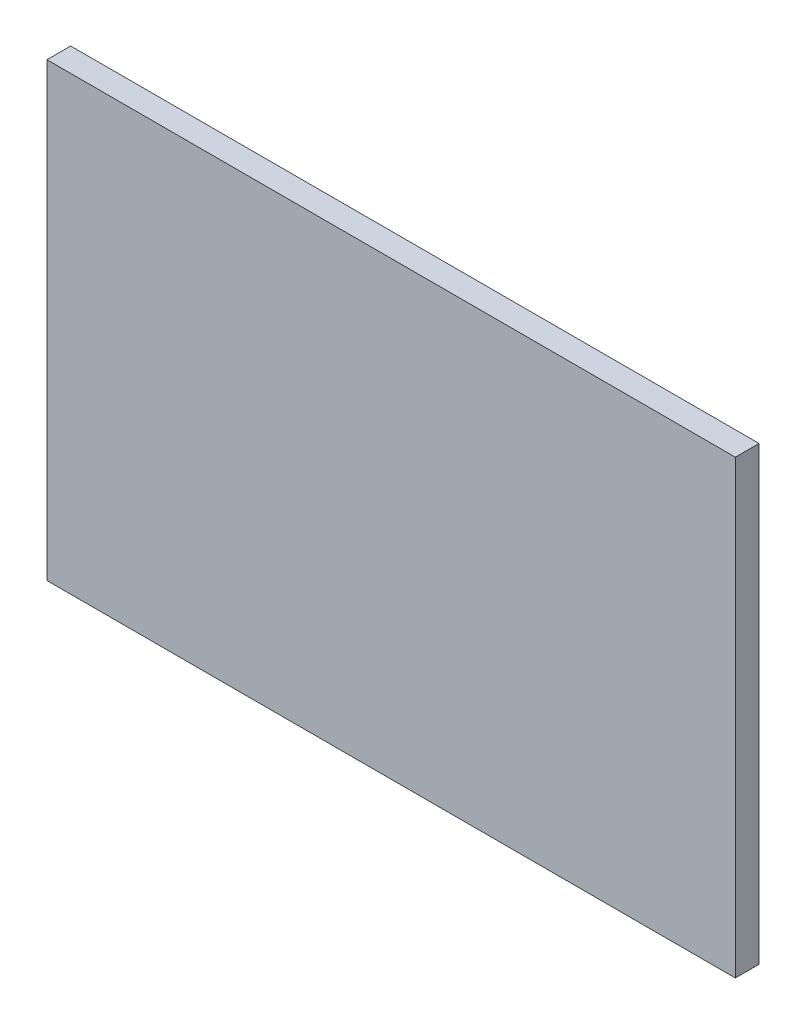
ISO-10303-21;
HEADER;
FILE_DESCRIPTION(('STEP AP214'),'2;1');
FILE_NAME('part.step','',(''),(''),'','','');
FILE_SCHEMA(('AUTOMOTIVE_DESIGN { 1 0 10303 214 1 1 1 1 }'));
ENDSEC;
DATA;
#1=APPLICATION_CONTEXT('core data for automotive mechanical design processes');
#2=APPLICATION_PROTOCOL_DEFINITION('international standard','automotive_design',2000,#1);
#3=PRODUCT_CONTEXT('',#1,'mechanical');
#4=PRODUCT('Part','Part','',(#3));
#5=PRODUCT_RELATED_PRODUCT_CATEGORY('part','',(#4));
#6=PRODUCT_DEFINITION_FORMATION('','',#4);
#7=PRODUCT_DEFINITION_CONTEXT('part definition',#1,'design');
#8=PRODUCT_DEFINITION('design','',#6,#7);
#9=PRODUCT_DEFINITION_SHAPE('','',#8);
#10=(LENGTH_UNIT() NAMED_UNIT(*) SI_UNIT(.MILLI.,.METRE.));
#11=(NAMED_UNIT(*) PLANE_ANGLE_UNIT() SI_UNIT($,.RADIAN.));
#12=(NAMED_UNIT(*) SI_UNIT($,.STERADIAN.) SOLID_ANGLE_UNIT());
#13=UNCERTAINTY_MEASURE_WITH_UNIT(LENGTH_MEASURE(1.E-05),#10,'distance_accuracy_value','');
#14=(GEOMETRIC_REPRESENTATION_CONTEXT(3) GLOBAL_UNCERTAINTY_ASSIGNED_CONTEXT((#13)) GLOBAL_UNIT_ASSIGNED_CONTEXT((#10,
#11,#12)) REPRESENTATION_CONTEXT('',''));
#15=CARTESIAN_POINT('',(0.,0.,0.));
#16=DIRECTION('',(0.,0.,1.));
#17=DIRECTION('',(1.,0.,0.));
#18=AXIS2_PLACEMENT_3D('',#15,#16,#17);
#19=CARTESIAN_POINT('',(12.224999298474,-8.025000596618,0.5));
#20=DIRECTION('',(0.,0.,1.));
#21=DIRECTION('',(1.,0.,0.));
#22=AXIS2_PLACEMENT_3D('',#19,#20,#21);
#23=PLANE('',#22);
#24=DIRECTION('',(8.74227765734797E-08,-0.999999999999996,0.));
#25=VECTOR('',#24,1.);
#26=CARTESIAN_POINT('',(10.774999298474,-8.025000723382,0.5));
#27=LINE('',#26,#25);
#28=CARTESIAN_POINT('',(10.7749993399999,-8.97500072338176,0.5));
#29=VERTEX_POINT('',#28);
#30=CARTESIAN_POINT('',(10.774999298474,-8.02500069169051,0.5));
#31=VERTEX_POINT('',#30);
#32=EDGE_CURVE('E76',#29,#31,#27,.F.);
#33=ORIENTED_EDGE('',*,*,#32,.F.);
#34=DIRECTION('',(0.999999999999996,8.74227765734797E-08,0.));
#35=VECTOR('',#34,1.);
#36=CARTESIAN_POINT('',(12.224999381526,-8.975000596618,0.5));
#37=LINE('',#36,#35);
#38=CARTESIAN_POINT('',(12.2249993815258,-8.975000628309,0.5));
#39=VERTEX_POINT('',#38);
#40=EDGE_CURVE('E58',#39,#29,#37,.F.);
#41=ORIENTED_EDGE('',*,*,#40,.F.);
#42=DIRECTION('',(8.74227765734797E-08,-0.999999999999996,0.));
#43=VECTOR('',#42,1.);
#44=CARTESIAN_POINT('',(12.224999298474,-8.025000596618,0.5));
#45=LINE('',#44,#43);
#46=CARTESIAN_POINT('',(12.224999319237,-8.025000596618,0.5));
#47=VERTEX_POINT('',#46);
#48=EDGE_CURVE('E20',#39,#47,#45,.F.);
#49=ORIENTED_EDGE('',*,*,#48,.T.);
#50=DIRECTION('',(0.999999999999996,8.74227765734797E-08,0.));
#51=VECTOR('',#50,1.);
#52=CARTESIAN_POINT('',(12.224999298474,-8.025000596618,0.5));
#53=LINE('',#52,#51);
#54=EDGE_CURVE('E55',#47,#31,#53,.F.);
#55=ORIENTED_EDGE('',*,*,#54,.T.);
#56=EDGE_LOOP('',(#33,#41,#49,#55));
#57=FACE_BOUND('',#56,.T.);
#58=ADVANCED_FACE('F17',(#57),#23,.T.);
#59=CARTESIAN_POINT('',(12.224999298474,-8.025000596618,0.45));
#60=DIRECTION('',(-0.999999999999996,-8.74227765734797E-08,0.));
#61=DIRECTION('',(8.74227765734797E-08,-0.999999999999996,0.));
#62=AXIS2_PLACEMENT_3D('',#59,#60,#61);
#63=PLANE('',#62);
#64=DIRECTION('',(0.,0.,1.));
#65=VECTOR('',#64,1.);
#66=CARTESIAN_POINT('',(12.224999381526,-8.975000596618,0.45));
#67=LINE('',#66,#65);
#68=CARTESIAN_POINT('',(12.2249993815258,-8.975000628309,0.45));
#69=VERTEX_POINT('',#68);
#70=EDGE_CURVE('E78',#69,#39,#67,.T.);
#71=ORIENTED_EDGE('',*,*,#70,.F.);
#72=DIRECTION('',(0.,1.,0.));
#73=VECTOR('',#72,1.);
#74=CARTESIAN_POINT('',(12.224999381526,-8.025000596618,0.45));
#75=LINE('',#74,#73);
#76=CARTESIAN_POINT('',(12.224999319237,-8.025000596618,0.45));
#77=VERTEX_POINT('',#76);
#78=EDGE_CURVE('E73',#69,#77,#75,.T.);
#79=ORIENTED_EDGE('',*,*,#78,.T.);
#80=DIRECTION('',(0.,0.,1.));
#81=VECTOR('',#80,1.);
#82=CARTESIAN_POINT('',(12.224999298474,-8.025000596618,0.45));
#83=LINE('',#82,#81);
#84=EDGE_CURVE('E63',#77,#47,#83,.T.);
#85=ORIENTED_EDGE('',*,*,#84,.T.);
#86=ORIENTED_EDGE('',*,*,#48,.F.);
#87=EDGE_LOOP('',(#71,#79,#85,#86));
#88=FACE_BOUND('',#87,.T.);
#89=ADVANCED_FACE('F72',(#88),#63,.F.);
#90=CARTESIAN_POINT('',(12.224999298474,-8.025000596618,0.45));
#91=DIRECTION('',(8.74227765734797E-08,-0.999999999999996,0.));
#92=DIRECTION('',(0.999999999999996,8.74227765734797E-08,0.));
#93=AXIS2_PLACEMENT_3D('',#90,#91,#92);
#94=PLANE('',#93);
#95=ORIENTED_EDGE('',*,*,#54,.F.);
#96=ORIENTED_EDGE('',*,*,#84,.F.);
#97=DIRECTION('',(1.,0.,0.));
#98=VECTOR('',#97,1.);
#99=CARTESIAN_POINT('',(12.224999298474,-8.025000596618,0.45));
#100=LINE('',#99,#98);
#101=CARTESIAN_POINT('',(10.774999298474,-8.02500069169051,0.45));
#102=VERTEX_POINT('',#101);
#103=EDGE_CURVE('E83',#77,#102,#100,.F.);
#104=ORIENTED_EDGE('',*,*,#103,.T.);
#105=DIRECTION('',(0.,0.,1.));
#106=VECTOR('',#105,1.);
#107=CARTESIAN_POINT('',(10.774999298474,-8.025000723382,0.45));
#108=LINE('',#107,#106);
#109=EDGE_CURVE('E69',#31,#102,#108,.F.);
#110=ORIENTED_EDGE('',*,*,#109,.F.);
#111=EDGE_LOOP('',(#95,#96,#104,#110));
#112=FACE_BOUND('',#111,.T.);
#113=ADVANCED_FACE('F66',(#112),#94,.F.);
#114=CARTESIAN_POINT('',(10.774999298474,-8.025000723382,0.45));
#115=DIRECTION('',(-0.999999999999996,-8.74227765734797E-08,0.));
#116=DIRECTION('',(8.74227765734797E-08,-0.999999999999996,0.));
#117=AXIS2_PLACEMENT_3D('',#114,#115,#116);
#118=PLANE('',#117);
#119=DIRECTION('',(0.,0.,1.));
#120=VECTOR('',#119,1.);
#121=CARTESIAN_POINT('',(10.774999381526,-8.97500072338103,0.45));
#122=LINE('',#121,#120);
#123=CARTESIAN_POINT('',(10.7749993607628,-8.97500072338176,0.45));
#124=VERTEX_POINT('',#123);
#125=EDGE_CURVE('E34',#29,#124,#122,.F.);
#126=ORIENTED_EDGE('',*,*,#125,.F.);
#127=ORIENTED_EDGE('',*,*,#32,.T.);
#128=ORIENTED_EDGE('',*,*,#109,.T.);
#129=DIRECTION('',(0.,1.,0.));
#130=VECTOR('',#129,1.);
#131=CARTESIAN_POINT('',(10.774999298474,-8.025000596618,0.45));
#132=LINE('',#131,#130);
#133=EDGE_CURVE('E26',#102,#124,#132,.F.);
#134=ORIENTED_EDGE('',*,*,#133,.T.);
#135=EDGE_LOOP('',(#126,#127,#128,#134));
#136=FACE_BOUND('',#135,.T.);
#137=ADVANCED_FACE('F88',(#136),#118,.T.);
#138=CARTESIAN_POINT('',(12.224999381526,-8.975000596618,0.45));
#139=DIRECTION('',(8.74227765734797E-08,-0.999999999999996,0.));
#140=DIRECTION('',(0.999999999999996,8.74227765734797E-08,0.));
#141=AXIS2_PLACEMENT_3D('',#138,#139,#140);
#142=PLANE('',#141);
#143=ORIENTED_EDGE('',*,*,#40,.T.);
#144=ORIENTED_EDGE('',*,*,#125,.T.);
#145=DIRECTION('',(1.,0.,0.));
#146=VECTOR('',#145,1.);
#147=CARTESIAN_POINT('',(12.224999298474,-8.975000723382,0.45));
#148=LINE('',#147,#146);
#149=EDGE_CURVE('E11',#124,#69,#148,.T.);
#150=ORIENTED_EDGE('',*,*,#149,.T.);
#151=ORIENTED_EDGE('',*,*,#70,.T.);
#152=EDGE_LOOP('',(#143,#144,#150,#151));
#153=FACE_BOUND('',#152,.T.);
#154=ADVANCED_FACE('F91',(#153),#142,.T.);
#155=CARTESIAN_POINT('',(12.224999298474,-8.025000596618,0.45));
#156=DIRECTION('',(0.,0.,1.));
#157=DIRECTION('',(1.,0.,0.));
#158=AXIS2_PLACEMENT_3D('',#155,#156,#157);
#159=PLANE('',#158);
#160=ORIENTED_EDGE('',*,*,#133,.F.);
#161=ORIENTED_EDGE('',*,*,#103,.F.);
#162=ORIENTED_EDGE('',*,*,#78,.F.);
#163=ORIENTED_EDGE('',*,*,#149,.F.);
#164=EDGE_LOOP('',(#160,#161,#162,#163));
#165=FACE_BOUND('',#164,.T.);
#166=ADVANCED_FACE('F90',(#165),#159,.F.);
#167=CLOSED_SHELL('',(#58,#89,#113,#137,#154,#166));
#168=MANIFOLD_SOLID_BREP('B1',#167);
#169=ADVANCED_BREP_SHAPE_REPRESENTATION('',(#18,#168),#14);
#170=SHAPE_DEFINITION_REPRESENTATION(#9,#169);
ENDSEC;
END-ISO-10303-21;
